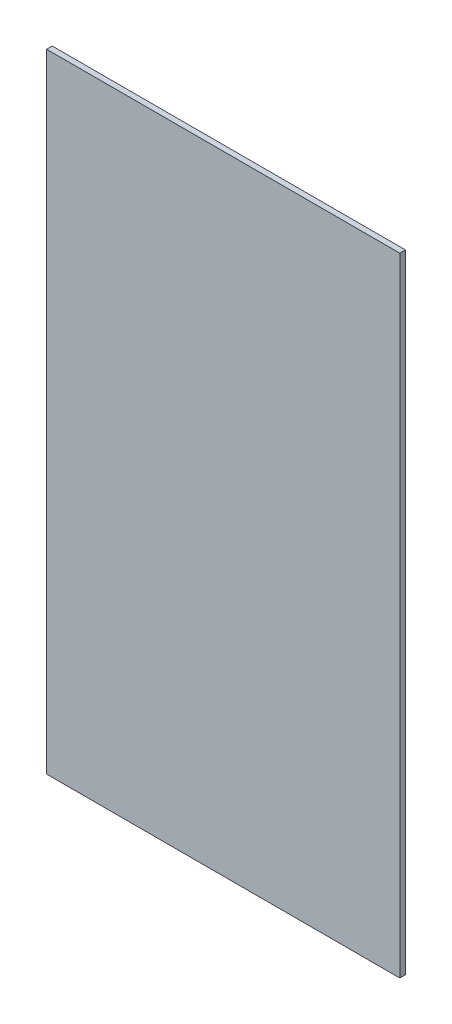
ISO-10303-21;
HEADER;
FILE_DESCRIPTION(('STEP AP214'),'2;1');
FILE_NAME('part.step','',(''),(''),'','','');
FILE_SCHEMA(('AUTOMOTIVE_DESIGN { 1 0 10303 214 1 1 1 1 }'));
ENDSEC;
DATA;
#1=APPLICATION_CONTEXT('core data for automotive mechanical design processes');
#2=APPLICATION_PROTOCOL_DEFINITION('international standard','automotive_design',2000,#1);
#3=PRODUCT_CONTEXT('',#1,'mechanical');
#4=PRODUCT('Part','Part','',(#3));
#5=PRODUCT_RELATED_PRODUCT_CATEGORY('part','',(#4));
#6=PRODUCT_DEFINITION_FORMATION('','',#4);
#7=PRODUCT_DEFINITION_CONTEXT('part definition',#1,'design');
#8=PRODUCT_DEFINITION('design','',#6,#7);
#9=PRODUCT_DEFINITION_SHAPE('','',#8);
#10=(LENGTH_UNIT() NAMED_UNIT(*) SI_UNIT(.MILLI.,.METRE.));
#11=(NAMED_UNIT(*) PLANE_ANGLE_UNIT() SI_UNIT($,.RADIAN.));
#12=(NAMED_UNIT(*) SI_UNIT($,.STERADIAN.) SOLID_ANGLE_UNIT());
#13=UNCERTAINTY_MEASURE_WITH_UNIT(LENGTH_MEASURE(1.E-05),#10,'distance_accuracy_value','');
#14=(GEOMETRIC_REPRESENTATION_CONTEXT(3) GLOBAL_UNCERTAINTY_ASSIGNED_CONTEXT((#13)) GLOBAL_UNIT_ASSIGNED_CONTEXT((#10,
#11,#12)) REPRESENTATION_CONTEXT('',''));
#15=CARTESIAN_POINT('',(0.,0.,0.));
#16=DIRECTION('',(0.,0.,1.));
#17=DIRECTION('',(1.,0.,0.));
#18=AXIS2_PLACEMENT_3D('',#15,#16,#17);
#19=CARTESIAN_POINT('',(-27.8374511108486,-35.5700764194176,6.35));
#20=DIRECTION('',(0.,1.,0.));
#21=DIRECTION('',(0.,0.,1.));
#22=AXIS2_PLACEMENT_3D('',#19,#20,#21);
#23=PLANE('',#22);
#24=DIRECTION('',(1.,0.,0.));
#25=VECTOR('',#24,1.);
#26=CARTESIAN_POINT('',(-27.8374511108486,-35.5700764194176,0.));
#27=LINE('',#26,#25);
#28=CARTESIAN_POINT('',(-27.8374511108486,-35.5700764194176,0.));
#29=VERTEX_POINT('',#28);
#30=CARTESIAN_POINT('',(370.688548889151,-35.5700764194176,0.));
#31=VERTEX_POINT('',#30);
#32=EDGE_CURVE('E109',#29,#31,#27,.T.);
#33=ORIENTED_EDGE('',*,*,#32,.T.);
#34=DIRECTION('',(0.,0.,-1.));
#35=VECTOR('',#34,1.);
#36=CARTESIAN_POINT('',(370.688548889151,-35.5700764194176,6.35));
#37=LINE('',#36,#35);
#38=CARTESIAN_POINT('',(370.688548889151,-35.5700764194176,6.35));
#39=VERTEX_POINT('',#38);
#40=EDGE_CURVE('E11',#39,#31,#37,.T.);
#41=ORIENTED_EDGE('',*,*,#40,.F.);
#42=DIRECTION('',(1.,0.,0.));
#43=VECTOR('',#42,1.);
#44=CARTESIAN_POINT('',(-27.8374511108486,-35.5700764194176,6.35));
#45=LINE('',#44,#43);
#46=CARTESIAN_POINT('',(-27.8374511108486,-35.5700764194176,6.35));
#47=VERTEX_POINT('',#46);
#48=EDGE_CURVE('E82',#47,#39,#45,.T.);
#49=ORIENTED_EDGE('',*,*,#48,.F.);
#50=DIRECTION('',(0.,0.,-1.));
#51=VECTOR('',#50,1.);
#52=CARTESIAN_POINT('',(-27.8374511108486,-35.5700764194176,6.35));
#53=LINE('',#52,#51);
#54=EDGE_CURVE('E105',#47,#29,#53,.T.);
#55=ORIENTED_EDGE('',*,*,#54,.T.);
#56=EDGE_LOOP('',(#33,#41,#49,#55));
#57=FACE_BOUND('',#56,.T.);
#58=ADVANCED_FACE('F42',(#57),#23,.F.);
#59=CARTESIAN_POINT('',(370.688548889151,672.835923580582,6.35));
#60=DIRECTION('',(1.,0.,0.));
#61=DIRECTION('',(0.,1.,0.));
#62=AXIS2_PLACEMENT_3D('',#59,#60,#61);
#63=PLANE('',#62);
#64=DIRECTION('',(0.,-1.,0.));
#65=VECTOR('',#64,1.);
#66=CARTESIAN_POINT('',(370.688548889151,672.835923580582,0.));
#67=LINE('',#66,#65);
#68=CARTESIAN_POINT('',(370.688548889151,672.835923580582,0.));
#69=VERTEX_POINT('',#68);
#70=EDGE_CURVE('E91',#69,#31,#67,.T.);
#71=ORIENTED_EDGE('',*,*,#70,.F.);
#72=DIRECTION('',(0.,0.,-1.));
#73=VECTOR('',#72,1.);
#74=CARTESIAN_POINT('',(370.688548889151,672.835923580582,6.35));
#75=LINE('',#74,#73);
#76=CARTESIAN_POINT('',(370.688548889151,672.835923580582,6.35));
#77=VERTEX_POINT('',#76);
#78=EDGE_CURVE('E51',#77,#69,#75,.T.);
#79=ORIENTED_EDGE('',*,*,#78,.F.);
#80=DIRECTION('',(0.,-1.,0.));
#81=VECTOR('',#80,1.);
#82=CARTESIAN_POINT('',(370.688548889151,672.835923580582,6.35));
#83=LINE('',#82,#81);
#84=EDGE_CURVE('E89',#77,#39,#83,.T.);
#85=ORIENTED_EDGE('',*,*,#84,.T.);
#86=ORIENTED_EDGE('',*,*,#40,.T.);
#87=EDGE_LOOP('',(#71,#79,#85,#86));
#88=FACE_BOUND('',#87,.T.);
#89=ADVANCED_FACE('F88',(#88),#63,.T.);
#90=CARTESIAN_POINT('',(-27.8374511108487,672.835923580582,6.35));
#91=DIRECTION('',(0.,1.,0.));
#92=DIRECTION('',(0.,0.,1.));
#93=AXIS2_PLACEMENT_3D('',#90,#91,#92);
#94=PLANE('',#93);
#95=DIRECTION('',(1.,0.,0.));
#96=VECTOR('',#95,1.);
#97=CARTESIAN_POINT('',(-27.8374511108487,672.835923580582,0.));
#98=LINE('',#97,#96);
#99=CARTESIAN_POINT('',(-27.8374511108487,672.835923580582,0.));
#100=VERTEX_POINT('',#99);
#101=EDGE_CURVE('E115',#100,#69,#98,.T.);
#102=ORIENTED_EDGE('',*,*,#101,.F.);
#103=DIRECTION('',(0.,0.,-1.));
#104=VECTOR('',#103,1.);
#105=CARTESIAN_POINT('',(-27.8374511108487,672.835923580582,6.35));
#106=LINE('',#105,#104);
#107=CARTESIAN_POINT('',(-27.8374511108487,672.835923580582,6.35));
#108=VERTEX_POINT('',#107);
#109=EDGE_CURVE('E74',#108,#100,#106,.T.);
#110=ORIENTED_EDGE('',*,*,#109,.F.);
#111=DIRECTION('',(1.,0.,0.));
#112=VECTOR('',#111,1.);
#113=CARTESIAN_POINT('',(-27.8374511108487,672.835923580582,6.35));
#114=LINE('',#113,#112);
#115=EDGE_CURVE('E98',#108,#77,#114,.T.);
#116=ORIENTED_EDGE('',*,*,#115,.T.);
#117=ORIENTED_EDGE('',*,*,#78,.T.);
#118=EDGE_LOOP('',(#102,#110,#116,#117));
#119=FACE_BOUND('',#118,.T.);
#120=ADVANCED_FACE('F101',(#119),#94,.T.);
#121=CARTESIAN_POINT('',(-27.8374511108487,672.835923580582,6.35));
#122=DIRECTION('',(1.,0.,0.));
#123=DIRECTION('',(0.,1.,0.));
#124=AXIS2_PLACEMENT_3D('',#121,#122,#123);
#125=PLANE('',#124);
#126=DIRECTION('',(0.,-1.,0.));
#127=VECTOR('',#126,1.);
#128=CARTESIAN_POINT('',(-27.8374511108487,672.835923580582,0.));
#129=LINE('',#128,#127);
#130=EDGE_CURVE('E77',#100,#29,#129,.T.);
#131=ORIENTED_EDGE('',*,*,#130,.T.);
#132=ORIENTED_EDGE('',*,*,#54,.F.);
#133=DIRECTION('',(0.,-1.,0.));
#134=VECTOR('',#133,1.);
#135=CARTESIAN_POINT('',(-27.8374511108487,672.835923580582,6.35));
#136=LINE('',#135,#134);
#137=EDGE_CURVE('E59',#108,#47,#136,.T.);
#138=ORIENTED_EDGE('',*,*,#137,.F.);
#139=ORIENTED_EDGE('',*,*,#109,.T.);
#140=EDGE_LOOP('',(#131,#132,#138,#139));
#141=FACE_BOUND('',#140,.T.);
#142=ADVANCED_FACE('F132',(#141),#125,.F.);
#143=CARTESIAN_POINT('',(0.,0.,6.35));
#144=DIRECTION('',(0.,0.,-1.));
#145=DIRECTION('',(-1.,0.,0.));
#146=AXIS2_PLACEMENT_3D('',#143,#144,#145);
#147=PLANE('',#146);
#148=ORIENTED_EDGE('',*,*,#48,.T.);
#149=ORIENTED_EDGE('',*,*,#84,.F.);
#150=ORIENTED_EDGE('',*,*,#115,.F.);
#151=ORIENTED_EDGE('',*,*,#137,.T.);
#152=EDGE_LOOP('',(#148,#149,#150,#151));
#153=FACE_BOUND('',#152,.T.);
#154=ADVANCED_FACE('F97',(#153),#147,.F.);
#155=CARTESIAN_POINT('',(0.,0.,0.));
#156=DIRECTION('',(0.,0.,-1.));
#157=DIRECTION('',(-1.,0.,0.));
#158=AXIS2_PLACEMENT_3D('',#155,#156,#157);
#159=PLANE('',#158);
#160=ORIENTED_EDGE('',*,*,#32,.F.);
#161=ORIENTED_EDGE('',*,*,#130,.F.);
#162=ORIENTED_EDGE('',*,*,#101,.T.);
#163=ORIENTED_EDGE('',*,*,#70,.T.);
#164=EDGE_LOOP('',(#160,#161,#162,#163));
#165=FACE_BOUND('',#164,.T.);
#166=ADVANCED_FACE('F126',(#165),#159,.T.);
#167=CLOSED_SHELL('',(#58,#89,#120,#142,#154,#166));
#168=MANIFOLD_SOLID_BREP('B2',#167);
#169=ADVANCED_BREP_SHAPE_REPRESENTATION('',(#18,#168),#14);
#170=SHAPE_DEFINITION_REPRESENTATION(#9,#169);
ENDSEC;
END-ISO-10303-21;
